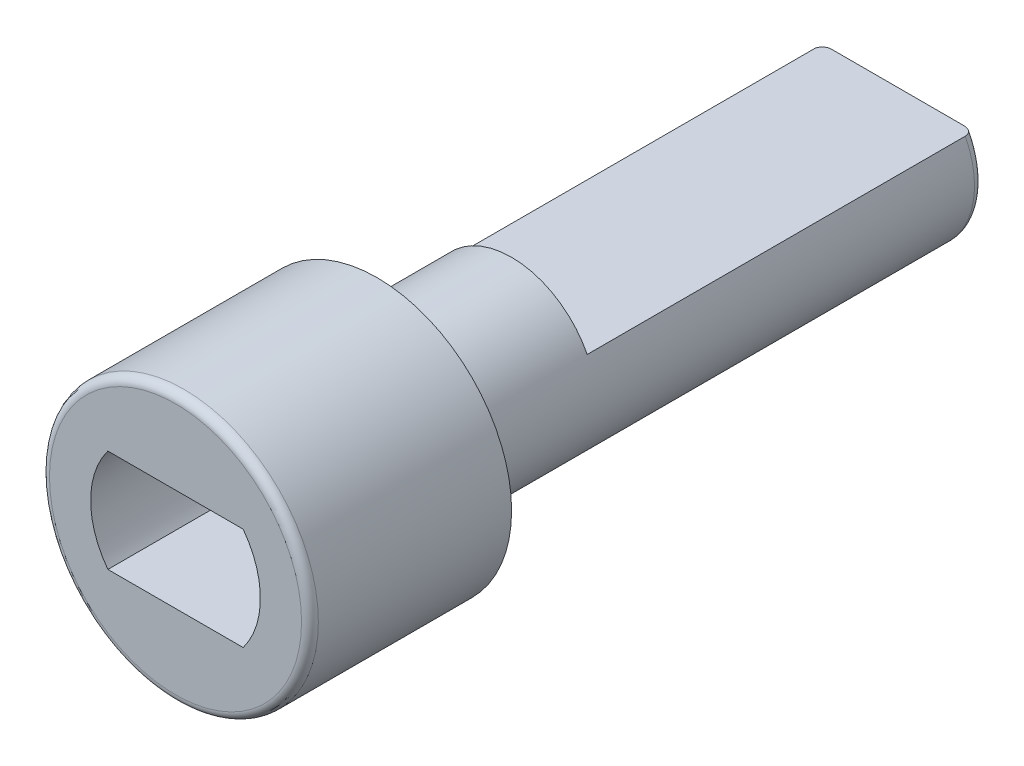
ISO-10303-21;
HEADER;
FILE_DESCRIPTION(('STEP AP214'),'2;1');
FILE_NAME('part.step','',(''),(''),'','','');
FILE_SCHEMA(('AUTOMOTIVE_DESIGN { 1 0 10303 214 1 1 1 1 }'));
ENDSEC;
DATA;
#1=APPLICATION_CONTEXT('core data for automotive mechanical design processes');
#2=APPLICATION_PROTOCOL_DEFINITION('international standard','automotive_design',2000,#1);
#3=PRODUCT_CONTEXT('',#1,'mechanical');
#4=PRODUCT('Part','Part','',(#3));
#5=PRODUCT_RELATED_PRODUCT_CATEGORY('part','',(#4));
#6=PRODUCT_DEFINITION_FORMATION('','',#4);
#7=PRODUCT_DEFINITION_CONTEXT('part definition',#1,'design');
#8=PRODUCT_DEFINITION('design','',#6,#7);
#9=PRODUCT_DEFINITION_SHAPE('','',#8);
#10=(LENGTH_UNIT() NAMED_UNIT(*) SI_UNIT(.MILLI.,.METRE.));
#11=(NAMED_UNIT(*) PLANE_ANGLE_UNIT() SI_UNIT($,.RADIAN.));
#12=(NAMED_UNIT(*) SI_UNIT($,.STERADIAN.) SOLID_ANGLE_UNIT());
#13=UNCERTAINTY_MEASURE_WITH_UNIT(LENGTH_MEASURE(1.E-05),#10,'distance_accuracy_value','');
#14=(GEOMETRIC_REPRESENTATION_CONTEXT(3) GLOBAL_UNCERTAINTY_ASSIGNED_CONTEXT((#13)) GLOBAL_UNIT_ASSIGNED_CONTEXT((#10,
#11,#12)) REPRESENTATION_CONTEXT('',''));
#15=CARTESIAN_POINT('',(0.,0.,0.));
#16=DIRECTION('',(0.,0.,1.));
#17=DIRECTION('',(1.,0.,0.));
#18=AXIS2_PLACEMENT_3D('',#15,#16,#17);
#19=CARTESIAN_POINT('',(0.,0.,15.5));
#20=DIRECTION('',(0.,0.,-1.));
#21=DIRECTION('',(-1.,0.,0.));
#22=AXIS2_PLACEMENT_3D('',#19,#20,#21);
#23=CYLINDRICAL_SURFACE('',#22,2.525);
#24=CARTESIAN_POINT('',(0.,0.,11.5));
#25=DIRECTION('',(0.,0.,1.));
#26=DIRECTION('',(1.,0.,0.));
#27=AXIS2_PLACEMENT_3D('',#24,#25,#26);
#28=CIRCLE('',#27,2.525);
#29=CARTESIAN_POINT('',(2.25,1.14591666363658,11.5));
#30=VERTEX_POINT('',#29);
#31=CARTESIAN_POINT('',(-2.25,1.14591666363658,11.5));
#32=VERTEX_POINT('',#31);
#33=EDGE_CURVE('E111',#30,#32,#28,.T.);
#34=ORIENTED_EDGE('',*,*,#33,.T.);
#35=DIRECTION('',(0.,0.,-1.));
#36=VECTOR('',#35,1.);
#37=CARTESIAN_POINT('',(-2.25,1.14591666363658,11.5));
#38=LINE('',#37,#36);
#39=CARTESIAN_POINT('',(-2.25,1.14591666363658,0.25));
#40=VERTEX_POINT('',#39);
#41=EDGE_CURVE('E101',#32,#40,#38,.T.);
#42=ORIENTED_EDGE('',*,*,#41,.T.);
#43=CARTESIAN_POINT('',(0.,0.,0.25));
#44=DIRECTION('',(0.,0.,1.));
#45=DIRECTION('',(1.,0.,0.));
#46=AXIS2_PLACEMENT_3D('',#43,#44,#45);
#47=CIRCLE('',#46,2.525);
#48=CARTESIAN_POINT('',(2.25,1.14591666363658,0.25));
#49=VERTEX_POINT('',#48);
#50=EDGE_CURVE('E183',#40,#49,#47,.T.);
#51=ORIENTED_EDGE('',*,*,#50,.T.);
#52=DIRECTION('',(0.,0.,-1.));
#53=VECTOR('',#52,1.);
#54=CARTESIAN_POINT('',(2.25,1.14591666363658,11.5));
#55=LINE('',#54,#53);
#56=EDGE_CURVE('E59',#30,#49,#55,.T.);
#57=ORIENTED_EDGE('',*,*,#56,.F.);
#58=EDGE_LOOP('',(#34,#42,#51,#57));
#59=FACE_BOUND('',#58,.T.);
#60=CARTESIAN_POINT('',(0.,0.,15.5));
#61=DIRECTION('',(0.,0.,1.));
#62=DIRECTION('',(1.,0.,0.));
#63=AXIS2_PLACEMENT_3D('',#60,#61,#62);
#64=CIRCLE('',#63,2.525);
#65=CARTESIAN_POINT('',(2.525,0.,15.5));
#66=VERTEX_POINT('',#65);
#67=EDGE_CURVE('E171',#66,#66,#64,.T.);
#68=ORIENTED_EDGE('',*,*,#67,.F.);
#69=EDGE_LOOP('',(#68));
#70=FACE_BOUND('',#69,.T.);
#71=ADVANCED_FACE('F38',(#59,#70),#23,.T.);
#72=CARTESIAN_POINT('',(0.,0.,0.));
#73=DIRECTION('',(0.,0.,1.));
#74=DIRECTION('',(1.,0.,0.));
#75=AXIS2_PLACEMENT_3D('',#72,#73,#74);
#76=PLANE('',#75);
#77=CARTESIAN_POINT('',(0.,0.,0.));
#78=DIRECTION('',(0.,0.,1.));
#79=DIRECTION('',(1.,0.,0.));
#80=AXIS2_PLACEMENT_3D('',#77,#78,#79);
#81=CIRCLE('',#80,2.275);
#82=CARTESIAN_POINT('',(1.96532440070335,1.14591666363658,0.));
#83=VERTEX_POINT('',#82);
#84=CARTESIAN_POINT('',(-1.96532440070335,1.14591666363658,0.));
#85=VERTEX_POINT('',#84);
#86=EDGE_CURVE('E186',#83,#85,#81,.F.);
#87=ORIENTED_EDGE('',*,*,#86,.T.);
#88=DIRECTION('',(-1.,0.,0.));
#89=VECTOR('',#88,1.);
#90=CARTESIAN_POINT('',(2.25,1.14591666363658,0.));
#91=LINE('',#90,#89);
#92=EDGE_CURVE('E116',#83,#85,#91,.T.);
#93=ORIENTED_EDGE('',*,*,#92,.F.);
#94=EDGE_LOOP('',(#87,#93));
#95=FACE_BOUND('',#94,.T.);
#96=ADVANCED_FACE('F229',(#95),#76,.F.);
#97=CARTESIAN_POINT('',(0.,0.,21.5));
#98=DIRECTION('',(0.,0.,-1.));
#99=DIRECTION('',(-1.,0.,0.));
#100=AXIS2_PLACEMENT_3D('',#97,#98,#99);
#101=CYLINDRICAL_SURFACE('',#100,4.);
#102=CARTESIAN_POINT('',(0.,0.,21.25));
#103=DIRECTION('',(0.,0.,1.));
#104=DIRECTION('',(1.,0.,0.));
#105=AXIS2_PLACEMENT_3D('',#102,#103,#104);
#106=CIRCLE('',#105,4.);
#107=CARTESIAN_POINT('',(4.,0.,21.25));
#108=VERTEX_POINT('',#107);
#109=EDGE_CURVE('E179',#108,#108,#106,.F.);
#110=ORIENTED_EDGE('',*,*,#109,.T.);
#111=EDGE_LOOP('',(#110));
#112=FACE_BOUND('',#111,.T.);
#113=CARTESIAN_POINT('',(0.,0.,15.5));
#114=DIRECTION('',(0.,0.,1.));
#115=DIRECTION('',(1.,0.,0.));
#116=AXIS2_PLACEMENT_3D('',#113,#114,#115);
#117=CIRCLE('',#116,4.);
#118=CARTESIAN_POINT('',(4.,0.,15.5));
#119=VERTEX_POINT('',#118);
#120=EDGE_CURVE('E159',#119,#119,#117,.T.);
#121=ORIENTED_EDGE('',*,*,#120,.T.);
#122=EDGE_LOOP('',(#121));
#123=FACE_BOUND('',#122,.T.);
#124=ADVANCED_FACE('F222',(#112,#123),#101,.T.);
#125=CARTESIAN_POINT('',(0.,0.,21.5));
#126=DIRECTION('',(0.,0.,1.));
#127=DIRECTION('',(1.,0.,0.));
#128=AXIS2_PLACEMENT_3D('',#125,#126,#127);
#129=PLANE('',#128);
#130=CARTESIAN_POINT('',(0.,0.,21.5));
#131=DIRECTION('',(0.,0.,1.));
#132=DIRECTION('',(1.,0.,0.));
#133=AXIS2_PLACEMENT_3D('',#130,#131,#132);
#134=CIRCLE('',#133,3.75);
#135=CARTESIAN_POINT('',(3.75,0.,21.5));
#136=VERTEX_POINT('',#135);
#137=EDGE_CURVE('E175',#136,#136,#134,.T.);
#138=ORIENTED_EDGE('',*,*,#137,.T.);
#139=EDGE_LOOP('',(#138));
#140=FACE_BOUND('',#139,.T.);
#141=CARTESIAN_POINT('',(0.,0.,21.5));
#142=DIRECTION('',(0.,0.,1.));
#143=DIRECTION('',(1.,0.,0.));
#144=AXIS2_PLACEMENT_3D('',#141,#142,#143);
#145=CIRCLE('',#144,2.525);
#146=CARTESIAN_POINT('',(-2.01246117974981,1.525,21.5));
#147=VERTEX_POINT('',#146);
#148=CARTESIAN_POINT('',(-2.01246117974981,-1.525,21.5));
#149=VERTEX_POINT('',#148);
#150=EDGE_CURVE('E67',#147,#149,#145,.T.);
#151=ORIENTED_EDGE('',*,*,#150,.F.);
#152=DIRECTION('',(1.,0.,0.));
#153=VECTOR('',#152,1.);
#154=CARTESIAN_POINT('',(-2.01246117974981,1.525,21.5));
#155=LINE('',#154,#153);
#156=CARTESIAN_POINT('',(2.01246117974981,1.525,21.5));
#157=VERTEX_POINT('',#156);
#158=EDGE_CURVE('E131',#147,#157,#155,.T.);
#159=ORIENTED_EDGE('',*,*,#158,.T.);
#160=CARTESIAN_POINT('',(0.,0.,21.5));
#161=DIRECTION('',(0.,0.,1.));
#162=DIRECTION('',(1.,0.,0.));
#163=AXIS2_PLACEMENT_3D('',#160,#161,#162);
#164=CIRCLE('',#163,2.525);
#165=CARTESIAN_POINT('',(2.01246117974981,-1.525,21.5));
#166=VERTEX_POINT('',#165);
#167=EDGE_CURVE('E149',#166,#157,#164,.T.);
#168=ORIENTED_EDGE('',*,*,#167,.F.);
#169=DIRECTION('',(1.,0.,0.));
#170=VECTOR('',#169,1.);
#171=CARTESIAN_POINT('',(-2.01246117974981,-1.525,21.5));
#172=LINE('',#171,#170);
#173=EDGE_CURVE('E145',#149,#166,#172,.T.);
#174=ORIENTED_EDGE('',*,*,#173,.F.);
#175=EDGE_LOOP('',(#151,#159,#168,#174));
#176=FACE_BOUND('',#175,.T.);
#177=ADVANCED_FACE('F219',(#140,#176),#129,.T.);
#178=CARTESIAN_POINT('',(0.,0.,15.5));
#179=DIRECTION('',(0.,0.,1.));
#180=DIRECTION('',(1.,0.,0.));
#181=AXIS2_PLACEMENT_3D('',#178,#179,#180);
#182=PLANE('',#181);
#183=ORIENTED_EDGE('',*,*,#67,.T.);
#184=EDGE_LOOP('',(#183));
#185=FACE_BOUND('',#184,.T.);
#186=ORIENTED_EDGE('',*,*,#120,.F.);
#187=EDGE_LOOP('',(#186));
#188=FACE_BOUND('',#187,.T.);
#189=ADVANCED_FACE('F218',(#185,#188),#182,.F.);
#190=CARTESIAN_POINT('',(0.,0.,16.5));
#191=DIRECTION('',(0.,0.,1.));
#192=DIRECTION('',(1.,0.,0.));
#193=AXIS2_PLACEMENT_3D('',#190,#191,#192);
#194=CYLINDRICAL_SURFACE('',#193,2.525);
#195=ORIENTED_EDGE('',*,*,#150,.T.);
#196=DIRECTION('',(0.,0.,1.));
#197=VECTOR('',#196,1.);
#198=CARTESIAN_POINT('',(-2.01246117974981,-1.525,16.5));
#199=LINE('',#198,#197);
#200=CARTESIAN_POINT('',(-2.01246117974981,-1.525,16.5));
#201=VERTEX_POINT('',#200);
#202=EDGE_CURVE('E142',#201,#149,#199,.T.);
#203=ORIENTED_EDGE('',*,*,#202,.F.);
#204=CARTESIAN_POINT('',(0.,0.,16.5));
#205=DIRECTION('',(0.,0.,1.));
#206=DIRECTION('',(1.,0.,0.));
#207=AXIS2_PLACEMENT_3D('',#204,#205,#206);
#208=CIRCLE('',#207,2.525);
#209=CARTESIAN_POINT('',(-2.01246117974981,1.525,16.5));
#210=VERTEX_POINT('',#209);
#211=EDGE_CURVE('E126',#210,#201,#208,.T.);
#212=ORIENTED_EDGE('',*,*,#211,.F.);
#213=DIRECTION('',(0.,0.,1.));
#214=VECTOR('',#213,1.);
#215=CARTESIAN_POINT('',(-2.01246117974981,1.525,16.5));
#216=LINE('',#215,#214);
#217=EDGE_CURVE('E156',#210,#147,#216,.T.);
#218=ORIENTED_EDGE('',*,*,#217,.T.);
#219=EDGE_LOOP('',(#195,#203,#212,#218));
#220=FACE_BOUND('',#219,.T.);
#221=ADVANCED_FACE('F208',(#220),#194,.F.);
#222=CARTESIAN_POINT('',(-2.01246117974981,1.525,16.5));
#223=DIRECTION('',(0.,-1.,0.));
#224=DIRECTION('',(0.,0.,-1.));
#225=AXIS2_PLACEMENT_3D('',#222,#223,#224);
#226=PLANE('',#225);
#227=ORIENTED_EDGE('',*,*,#158,.F.);
#228=ORIENTED_EDGE('',*,*,#217,.F.);
#229=DIRECTION('',(1.,0.,0.));
#230=VECTOR('',#229,1.);
#231=CARTESIAN_POINT('',(-2.01246117974981,1.525,16.5));
#232=LINE('',#231,#230);
#233=CARTESIAN_POINT('',(2.01246117974981,1.525,16.5));
#234=VERTEX_POINT('',#233);
#235=EDGE_CURVE('E139',#210,#234,#232,.T.);
#236=ORIENTED_EDGE('',*,*,#235,.T.);
#237=DIRECTION('',(0.,0.,1.));
#238=VECTOR('',#237,1.);
#239=CARTESIAN_POINT('',(2.01246117974981,1.525,16.5));
#240=LINE('',#239,#238);
#241=EDGE_CURVE('E160',#234,#157,#240,.T.);
#242=ORIENTED_EDGE('',*,*,#241,.T.);
#243=EDGE_LOOP('',(#227,#228,#236,#242));
#244=FACE_BOUND('',#243,.T.);
#245=ADVANCED_FACE('F204',(#244),#226,.T.);
#246=CARTESIAN_POINT('',(0.,0.,16.5));
#247=DIRECTION('',(0.,0.,1.));
#248=DIRECTION('',(1.,0.,0.));
#249=AXIS2_PLACEMENT_3D('',#246,#247,#248);
#250=CYLINDRICAL_SURFACE('',#249,2.525);
#251=ORIENTED_EDGE('',*,*,#167,.T.);
#252=ORIENTED_EDGE('',*,*,#241,.F.);
#253=CARTESIAN_POINT('',(0.,0.,16.5));
#254=DIRECTION('',(0.,0.,1.));
#255=DIRECTION('',(1.,0.,0.));
#256=AXIS2_PLACEMENT_3D('',#253,#254,#255);
#257=CIRCLE('',#256,2.525);
#258=CARTESIAN_POINT('',(2.01246117974981,-1.525,16.5));
#259=VERTEX_POINT('',#258);
#260=EDGE_CURVE('E135',#259,#234,#257,.T.);
#261=ORIENTED_EDGE('',*,*,#260,.F.);
#262=DIRECTION('',(0.,0.,1.));
#263=VECTOR('',#262,1.);
#264=CARTESIAN_POINT('',(2.01246117974981,-1.525,16.5));
#265=LINE('',#264,#263);
#266=EDGE_CURVE('E163',#259,#166,#265,.T.);
#267=ORIENTED_EDGE('',*,*,#266,.T.);
#268=EDGE_LOOP('',(#251,#252,#261,#267));
#269=FACE_BOUND('',#268,.T.);
#270=ADVANCED_FACE('F207',(#269),#250,.F.);
#271=CARTESIAN_POINT('',(-2.01246117974981,-1.525,16.5));
#272=DIRECTION('',(0.,-1.,0.));
#273=DIRECTION('',(0.,0.,-1.));
#274=AXIS2_PLACEMENT_3D('',#271,#272,#273);
#275=PLANE('',#274);
#276=ORIENTED_EDGE('',*,*,#173,.T.);
#277=ORIENTED_EDGE('',*,*,#266,.F.);
#278=DIRECTION('',(1.,0.,0.));
#279=VECTOR('',#278,1.);
#280=CARTESIAN_POINT('',(-2.01246117974981,-1.525,16.5));
#281=LINE('',#280,#279);
#282=EDGE_CURVE('E130',#201,#259,#281,.T.);
#283=ORIENTED_EDGE('',*,*,#282,.F.);
#284=ORIENTED_EDGE('',*,*,#202,.T.);
#285=EDGE_LOOP('',(#276,#277,#283,#284));
#286=FACE_BOUND('',#285,.T.);
#287=ADVANCED_FACE('F202',(#286),#275,.F.);
#288=CARTESIAN_POINT('',(0.,0.,16.5));
#289=DIRECTION('',(0.,0.,1.));
#290=DIRECTION('',(1.,0.,0.));
#291=AXIS2_PLACEMENT_3D('',#288,#289,#290);
#292=PLANE('',#291);
#293=ORIENTED_EDGE('',*,*,#211,.T.);
#294=ORIENTED_EDGE('',*,*,#282,.T.);
#295=ORIENTED_EDGE('',*,*,#260,.T.);
#296=ORIENTED_EDGE('',*,*,#235,.F.);
#297=EDGE_LOOP('',(#293,#294,#295,#296));
#298=FACE_BOUND('',#297,.T.);
#299=ADVANCED_FACE('F197',(#298),#292,.T.);
#300=CARTESIAN_POINT('',(0.,0.,21.25));
#301=DIRECTION('',(0.,0.,1.));
#302=DIRECTION('',(1.,0.,0.));
#303=AXIS2_PLACEMENT_3D('',#300,#301,#302);
#304=TOROIDAL_SURFACE('',#303,3.75,0.25);
#305=ORIENTED_EDGE('',*,*,#109,.F.);
#306=EDGE_LOOP('',(#305));
#307=FACE_BOUND('',#306,.T.);
#308=ORIENTED_EDGE('',*,*,#137,.F.);
#309=EDGE_LOOP('',(#308));
#310=FACE_BOUND('',#309,.T.);
#311=ADVANCED_FACE('F201',(#307,#310),#304,.T.);
#312=CARTESIAN_POINT('',(0.,0.,0.25));
#313=DIRECTION('',(0.,0.,1.));
#314=DIRECTION('',(1.,0.,0.));
#315=AXIS2_PLACEMENT_3D('',#312,#313,#314);
#316=TOROIDAL_SURFACE('',#315,2.275,0.25);
#317=CARTESIAN_POINT('',(-2.16900695528066,1.14591666363658,0.0745600172399887));
#318=CARTESIAN_POINT('',(-2.17923527849151,1.14591666363658,0.0837403206430242));
#319=CARTESIAN_POINT('',(-2.18874730279702,1.14591666363658,0.0937153460968964));
#320=CARTESIAN_POINT('',(-2.2060151504754,1.14591666363658,0.115088700523563));
#321=CARTESIAN_POINT('',(-2.21377174352699,1.14591666363658,0.126486402301537));
#322=CARTESIAN_POINT('',(-2.227240008607,1.14591666363658,0.150496408710378));
#323=CARTESIAN_POINT('',(-2.23294363721828,1.14591666363658,0.163113250323538));
#324=CARTESIAN_POINT('',(-2.24199518025735,1.14591666363658,0.18916826732096));
#325=CARTESIAN_POINT('',(-2.24534366625801,1.14591666363658,0.202606242562099));
#326=CARTESIAN_POINT('',(-2.24939097766036,1.14591666363658,0.229056482598229));
#327=CARTESIAN_POINT('',(-2.25023550269271,1.14591666363658,0.24204655582997));
#328=CARTESIAN_POINT('',(-2.24965180916554,1.14591666363658,0.267973668227039));
#329=CARTESIAN_POINT('',(-2.24822408637882,1.14591666363658,0.28091071834385));
#330=CARTESIAN_POINT('',(-2.24324550924022,1.14591666363658,0.305935527008762));
#331=CARTESIAN_POINT('',(-2.23976398058059,1.14591666363658,0.318037214595716));
#332=CARTESIAN_POINT('',(-2.23088223801558,1.14591666363658,0.34151188878085));
#333=CARTESIAN_POINT('',(-2.2254818848191,1.14591666363658,0.35288482240664));
#334=CARTESIAN_POINT('',(-2.21276035951773,1.14591666363658,0.375004103867307));
#335=CARTESIAN_POINT('',(-2.20538126379806,1.14591666363658,0.385717020487018));
#336=CARTESIAN_POINT('',(-2.18906105764171,1.14591666363658,0.405874726649951));
#337=CARTESIAN_POINT('',(-2.18011948159739,1.14591666363658,0.415319136699619));
#338=CARTESIAN_POINT('',(-2.16013433959433,1.14591666363658,0.433540275250816));
#339=CARTESIAN_POINT('',(-2.14897658419499,1.14591666363658,0.442191531745156));
#340=CARTESIAN_POINT('',(-2.12549335793827,1.14591666363658,0.457723912200645));
#341=CARTESIAN_POINT('',(-2.11316739471442,1.14591666363658,0.464604285204367));
#342=CARTESIAN_POINT('',(-2.08619976833496,1.14591666363658,0.477233098483796));
#343=CARTESIAN_POINT('',(-2.07145474340858,1.14591666363658,0.482760725507477));
#344=CARTESIAN_POINT('',(-2.04130503325845,1.14591666363658,0.491547046903452));
#345=CARTESIAN_POINT('',(-2.02590003566998,1.14591666363658,0.494804653997103));
#346=CARTESIAN_POINT('',(-1.99299355628005,1.14591666363658,0.499319237453634));
#347=CARTESIAN_POINT('',(-1.97545443588414,1.14591666363658,0.500303581202269));
#348=CARTESIAN_POINT('',(-1.94043433714648,1.14591666363658,0.499533963035862));
#349=CARTESIAN_POINT('',(-1.92295338798909,1.14591666363658,0.497778788401189));
#350=CARTESIAN_POINT('',(-1.88719931215402,1.14591666363658,0.491354858928986));
#351=CARTESIAN_POINT('',(-1.86896251216425,1.14591666363658,0.486481265733475));
#352=CARTESIAN_POINT('',(-1.83356731540892,1.14591666363658,0.473692454434547));
#353=CARTESIAN_POINT('',(-1.81640960345884,1.14591666363658,0.465775327048972));
#354=CARTESIAN_POINT('',(-1.78407215333158,1.14591666363658,0.447123745977301));
#355=CARTESIAN_POINT('',(-1.76886394063394,1.14591666363658,0.436439049824155));
#356=CARTESIAN_POINT('',(-1.74082634881597,1.14591666363658,0.412312581634786));
#357=CARTESIAN_POINT('',(-1.72799162712389,1.14591666363658,0.398877148710957));
#358=CARTESIAN_POINT('',(-1.70892683708783,1.14591666363658,0.373960065768304));
#359=CARTESIAN_POINT('',(-1.70187136838885,1.14591666363658,0.363106285045098));
#360=CARTESIAN_POINT('',(-1.68965249683912,1.14591666363658,0.34037850018025));
#361=CARTESIAN_POINT('',(-1.68448759316578,1.14591666363658,0.328505314577046));
#362=CARTESIAN_POINT('',(-1.67632062984279,1.14591666363658,0.303958215223189));
#363=CARTESIAN_POINT('',(-1.67333039392448,1.14591666363658,0.291280325652653));
#364=CARTESIAN_POINT('',(-1.66976570347284,1.14591666363658,0.265588288933217));
#365=CARTESIAN_POINT('',(-1.66919034926799,1.14591666363658,0.252574268829174));
#366=CARTESIAN_POINT('',(-1.67043402203394,1.14591666363658,0.227860711264956));
#367=CARTESIAN_POINT('',(-1.67203899124443,1.14591666363658,0.216149756975506));
#368=CARTESIAN_POINT('',(-1.67717638077969,1.14591666363658,0.193161698883742));
#369=CARTESIAN_POINT('',(-1.68070884246461,1.14591666363658,0.181884604396757));
#370=CARTESIAN_POINT('',(-1.68955668141995,1.14591666363658,0.159928350865387));
#371=CARTESIAN_POINT('',(-1.69488952089875,1.14591666363658,0.149256292296353));
#372=CARTESIAN_POINT('',(-1.70708645950403,1.14591666363658,0.128830699568216));
#373=CARTESIAN_POINT('',(-1.71395107998455,1.14591666363658,0.119077479754526));
#374=CARTESIAN_POINT('',(-1.72986037963059,1.14591666363658,0.0995155204509449));
#375=CARTESIAN_POINT('',(-1.73906751283677,1.14591666363658,0.0898392795008385));
#376=CARTESIAN_POINT('',(-1.75876660698449,1.14591666363658,0.0719015353216568));
#377=CARTESIAN_POINT('',(-1.76925929055784,1.14591666363658,0.063640834109247));
#378=CARTESIAN_POINT('',(-1.79307603193074,1.14591666363658,0.0473393444209031));
#379=CARTESIAN_POINT('',(-1.80658096595654,1.14591666363658,0.0395626729303328));
#380=CARTESIAN_POINT('',(-1.83457709696002,1.14591666363658,0.0260553574753484));
#381=CARTESIAN_POINT('',(-1.84906886896315,1.14591666363658,0.0203259187811357));
#382=CARTESIAN_POINT('',(-1.88085554259765,1.14591666363658,0.0102710682532301));
#383=CARTESIAN_POINT('',(-1.898253028743,1.14591666363658,0.00626789601899665));
#384=CARTESIAN_POINT('',(-1.93346568317709,1.14591666363658,0.00104211391403849));
#385=CARTESIAN_POINT('',(-1.95128105914384,1.14591666363658,-0.00017908250124572));
#386=CARTESIAN_POINT('',(-1.98801220297235,1.14591666363658,0.000233951888678658));
#387=CARTESIAN_POINT('',(-2.0069264067048,1.14591666363658,0.00205339269273313));
#388=CARTESIAN_POINT('',(-2.0441534739392,1.14591666363658,0.00897451036961207));
#389=CARTESIAN_POINT('',(-2.06246640204242,1.14591666363658,0.0140758334150535));
#390=CARTESIAN_POINT('',(-2.09641971212324,1.14591666363658,0.0270393529754741));
#391=CARTESIAN_POINT('',(-2.11215666740206,1.14591666363658,0.0346476499209941));
#392=CARTESIAN_POINT('',(-2.14197877481453,1.14591666363658,0.0526024389262235));
#393=CARTESIAN_POINT('',(-2.15606615905571,1.14591666363658,0.0629451676529317));
#394=CARTESIAN_POINT('',(-2.16900695528066,1.14591666363658,0.0745600172399887));
#395=B_SPLINE_CURVE_WITH_KNOTS('',3,(#317,#318,#319,#320,#321,#322,#323,#324,#325,#326,#327,
#328,#329,#330,#331,#332,#333,#334,#335,#336,#337,#338,#339,#340,#341,#342,#343,#344,#345,#346,
#347,#348,#349,#350,#351,#352,#353,#354,#355,#356,#357,#358,#359,#360,#361,#362,#363,#364,#365,
#366,#367,#368,#369,#370,#371,#372,#373,#374,#375,#376,#377,#378,#379,#380,#381,#382,#383,#384,
#385,#386,#387,#388,#389,#390,#391,#392,#393,#394),.UNSPECIFIED.,.T.,.F.,(4,2,2,2,2,2,2,2,2,2,2,
2,2,2,2,2,2,2,2,2,2,2,2,2,2,2,2,2,2,2,2,2,2,2,2,2,2,2,4),(0.,0.0411812140181934,
0.0823443367679058,0.123667022897885,0.164979676903545,0.203836075818181,0.242683997970129,
0.280290128747462,0.317898989982826,0.35675899163058,0.39563059308262,0.437814536177074,
0.480016338349271,0.527065874192375,0.574137930039651,0.626614338655403,0.679113983918375,
0.735475755712047,0.791872942450238,0.847319146597388,0.902638984066066,0.941319330890322,
0.979968904433439,1.01882707705635,1.05767077166336,1.09296385043258,1.12825768655092,
1.16390417861856,1.19956282181347,1.23948039566988,1.2794205117826,1.32599041197581,
1.37258768433193,1.42591408317778,1.47926756985574,1.53599067903475,1.5927076737876,
1.64488126531955,1.69698342203863),.UNSPECIFIED.);
#396=EDGE_CURVE('E11',#85,#40,#395,.T.);
#397=ORIENTED_EDGE('',*,*,#396,.F.);
#398=ORIENTED_EDGE('',*,*,#86,.F.);
#399=CARTESIAN_POINT('',(1.67509249101219,1.14591666363658,0.202537561397909));
#400=CARTESIAN_POINT('',(1.67239202089577,1.14591666363658,0.214064504984725));
#401=CARTESIAN_POINT('',(1.67066112820519,1.14591666363658,0.22582044206193));
#402=CARTESIAN_POINT('',(1.66924227121717,1.14591666363658,0.249455619216457));
#403=CARTESIAN_POINT('',(1.66955414473728,1.14591666363658,0.261334849430337));
#404=CARTESIAN_POINT('',(1.67219998935459,1.14591666363658,0.28485197521267));
#405=CARTESIAN_POINT('',(1.674532041798,1.14591666363658,0.296490089044604));
#406=CARTESIAN_POINT('',(1.68107950663986,1.14591666363658,0.319221506119961));
#407=CARTESIAN_POINT('',(1.68529544231545,1.14591666363658,0.330314657040783));
#408=CARTESIAN_POINT('',(1.69550049423728,1.14591666363658,0.351926634550136));
#409=CARTESIAN_POINT('',(1.7015243066217,1.14591666363658,0.362428949838255));
#410=CARTESIAN_POINT('',(1.71505009451758,1.14591666363658,0.382428882492165));
#411=CARTESIAN_POINT('',(1.72255255028531,1.14591666363658,0.391926171885956));
#412=CARTESIAN_POINT('',(1.73986829312822,1.14591666363658,0.411003369516309));
#413=CARTESIAN_POINT('',(1.74985647201955,1.14591666363658,0.420424186880502));
#414=CARTESIAN_POINT('',(1.7710718509739,1.14591666363658,0.437744751109559));
#415=CARTESIAN_POINT('',(1.7822997809675,1.14591666363658,0.445643594285755));
#416=CARTESIAN_POINT('',(1.80766610343088,1.14591666363658,0.46106276045772));
#417=CARTESIAN_POINT('',(1.82197729384993,1.14591666363658,0.468299172396347));
#418=CARTESIAN_POINT('',(1.8515073212474,1.14591666363658,0.480591533054059));
#419=CARTESIAN_POINT('',(1.86672668700903,1.14591666363658,0.485646197072698));
#420=CARTESIAN_POINT('',(1.89979762321981,1.14591666363658,0.494061934312583));
#421=CARTESIAN_POINT('',(1.91773000466171,1.14591666363658,0.497108226044888));
#422=CARTESIAN_POINT('',(1.95385670814053,1.14591666363658,0.500291746797074));
#423=CARTESIAN_POINT('',(1.9720511379664,1.14591666363658,0.500427742417435));
#424=CARTESIAN_POINT('',(2.00901978726345,1.14591666363658,0.497665616096406));
#425=CARTESIAN_POINT('',(2.02778444503381,1.14591666363658,0.494634184152613));
#426=CARTESIAN_POINT('',(2.06448143519293,1.14591666363658,0.485271172012982));
#427=CARTESIAN_POINT('',(2.08241389848253,1.14591666363658,0.478940112764506));
#428=CARTESIAN_POINT('',(2.11576326983908,1.14591666363658,0.463447713827499));
#429=CARTESIAN_POINT('',(2.13126574727001,1.14591666363658,0.454471762375604));
#430=CARTESIAN_POINT('',(2.16025977815496,1.14591666363658,0.433703504021072));
#431=CARTESIAN_POINT('',(2.17375320000556,1.14591666363658,0.421913840738412));
#432=CARTESIAN_POINT('',(2.19653208663637,1.14591666363658,0.397399634550405));
#433=CARTESIAN_POINT('',(2.20613045154332,1.14591666363658,0.384966156683157));
#434=CARTESIAN_POINT('',(2.22274975256713,1.14591666363658,0.358481123661624));
#435=CARTESIAN_POINT('',(2.22977328170919,1.14591666363658,0.344431215200461));
#436=CARTESIAN_POINT('',(2.24015465686554,1.14591666363658,0.317014848055439));
#437=CARTESIAN_POINT('',(2.24385846963212,1.14591666363658,0.30377882473055));
#438=CARTESIAN_POINT('',(2.24879575887465,1.14591666363658,0.276854935511038));
#439=CARTESIAN_POINT('',(2.25003055069027,1.14591666363658,0.263167314152536));
#440=CARTESIAN_POINT('',(2.24997053057501,1.14591666363658,0.236800685736387));
#441=CARTESIAN_POINT('',(2.2488535731629,1.14591666363658,0.224120895939196));
#442=CARTESIAN_POINT('',(2.2444962990402,1.14591666363658,0.199133755547628));
#443=CARTESIAN_POINT('',(2.24125619703226,1.14591666363658,0.186826367425836));
#444=CARTESIAN_POINT('',(2.23280767400101,1.14591666363658,0.162960041563747));
#445=CARTESIAN_POINT('',(2.22760625336457,1.14591666363658,0.151398611219412));
#446=CARTESIAN_POINT('',(2.21543901072648,1.14591666363658,0.129247876267102));
#447=CARTESIAN_POINT('',(2.20847285689435,1.14591666363658,0.118658754997417));
#448=CARTESIAN_POINT('',(2.19256873511035,1.14591666363658,0.098078159903885));
#449=CARTESIAN_POINT('',(2.18353962545376,1.14591666363658,0.088157302630448));
#450=CARTESIAN_POINT('',(2.16408202535539,1.14591666363658,0.0698030862301378));
#451=CARTESIAN_POINT('',(2.15365303166618,1.14591666363658,0.061370264575673));
#452=CARTESIAN_POINT('',(2.13058101000234,1.14591666363658,0.0453188622098782));
#453=CARTESIAN_POINT('',(2.11782073017038,1.14591666363658,0.0378690347306498));
#454=CARTESIAN_POINT('',(2.09133390803994,1.14591666363658,0.0249564606434154));
#455=CARTESIAN_POINT('',(2.07760692315744,1.14591666363658,0.0194946313471584));
#456=CARTESIAN_POINT('',(2.04784454658289,1.14591666363658,0.0100397725903756));
#457=CARTESIAN_POINT('',(2.03172892158225,1.14591666363658,0.00629910398947454));
#458=CARTESIAN_POINT('',(1.99911832458776,1.14591666363658,0.00129876660157942));
#459=CARTESIAN_POINT('',(1.98262318969669,1.14591666363658,4.01840872017672E-05));
#460=CARTESIAN_POINT('',(1.94793033233981,1.14591666363658,-4.23042324462155E-05));
#461=CARTESIAN_POINT('',(1.92973161923979,1.14591666363658,0.001396923847206));
#462=CARTESIAN_POINT('',(1.89379011819986,1.14591666363658,0.00718085262750751));
#463=CARTESIAN_POINT('',(1.87604766387837,1.14591666363658,0.0115276199331083));
#464=CARTESIAN_POINT('',(1.84080640098725,1.14591666363658,0.0233080951442212));
#465=CARTESIAN_POINT('',(1.82334678047297,1.14591666363658,0.0308600490699668));
#466=CARTESIAN_POINT('',(1.79007410571473,1.14591666363658,0.0489906926991371));
#467=CARTESIAN_POINT('',(1.77425930518064,1.14591666363658,0.0595661267270027));
#468=CARTESIAN_POINT('',(1.7484880684723,1.14591666363658,0.0807636526515568));
#469=CARTESIAN_POINT('',(1.73803172623176,1.14591666363658,0.090779981515133));
#470=CARTESIAN_POINT('',(1.7189062211354,1.14591666363658,0.112392349761753));
#471=CARTESIAN_POINT('',(1.71023462126087,1.14591666363658,0.123986198639426));
#472=CARTESIAN_POINT('',(1.69637124636247,1.14591666363658,0.146498097534405));
#473=CARTESIAN_POINT('',(1.69084050066405,1.14591666363658,0.157207388950911));
#474=CARTESIAN_POINT('',(1.68157175240933,1.14591666363658,0.179378611371341));
#475=CARTESIAN_POINT('',(1.67783289068943,1.14591666363658,0.190840178674486));
#476=CARTESIAN_POINT('',(1.67509249101219,1.14591666363658,0.202537561397909));
#477=B_SPLINE_CURVE_WITH_KNOTS('',3,(#399,#400,#401,#402,#403,#404,#405,#406,#407,#408,#409,
#410,#411,#412,#413,#414,#415,#416,#417,#418,#419,#420,#421,#422,#423,#424,#425,#426,#427,#428,
#429,#430,#431,#432,#433,#434,#435,#436,#437,#438,#439,#440,#441,#442,#443,#444,#445,#446,#447,
#448,#449,#450,#451,#452,#453,#454,#455,#456,#457,#458,#459,#460,#461,#462,#463,#464,#465,#466,
#467,#468,#469,#470,#471,#472,#473,#474,#475,#476),.UNSPECIFIED.,.T.,.F.,(4,2,2,2,2,2,2,2,2,2,2,
2,2,2,2,2,2,2,2,2,2,2,2,2,2,2,2,2,2,2,2,2,2,2,2,2,2,2,4),(0.,0.0354753985110433,
0.0709479805387278,0.106386909567786,0.141835688421673,0.17801377454823,0.214203630565345,
0.255237464286842,0.296295587715346,0.344215959877478,0.392164511103892,0.446492144334909,
0.500842801460312,0.557576778649671,0.614301801353027,0.667737818456036,0.721123826095895,
0.767975304435593,0.814779469862616,0.855794115021257,0.896786904318957,0.93479116930925,
0.972791591717463,1.01065764656216,1.04853082681846,1.08860751370174,1.12869864662209,
1.17284680836451,1.21701531541785,1.26644352283208,1.31589335745891,1.37041834740313,
1.42498213356343,1.4817628314587,1.53848261685227,1.58175203996325,1.62496198198579,
1.66097921180311,1.69697915493845),.UNSPECIFIED.);
#478=EDGE_CURVE('E52',#49,#83,#477,.T.);
#479=ORIENTED_EDGE('',*,*,#478,.F.);
#480=ORIENTED_EDGE('',*,*,#50,.F.);
#481=EDGE_LOOP('',(#397,#398,#479,#480));
#482=FACE_BOUND('',#481,.T.);
#483=ADVANCED_FACE('F40',(#482),#316,.T.);
#484=CARTESIAN_POINT('',(2.25,1.14591666363658,11.5));
#485=DIRECTION('',(0.,-1.,0.));
#486=DIRECTION('',(0.,0.,-1.));
#487=AXIS2_PLACEMENT_3D('',#484,#485,#486);
#488=PLANE('',#487);
#489=ORIENTED_EDGE('',*,*,#396,.T.);
#490=ORIENTED_EDGE('',*,*,#41,.F.);
#491=DIRECTION('',(-1.,0.,0.));
#492=VECTOR('',#491,1.);
#493=CARTESIAN_POINT('',(2.25,1.14591666363658,11.5));
#494=LINE('',#493,#492);
#495=EDGE_CURVE('E104',#30,#32,#494,.T.);
#496=ORIENTED_EDGE('',*,*,#495,.F.);
#497=ORIENTED_EDGE('',*,*,#56,.T.);
#498=ORIENTED_EDGE('',*,*,#478,.T.);
#499=ORIENTED_EDGE('',*,*,#92,.T.);
#500=EDGE_LOOP('',(#489,#490,#496,#497,#498,#499));
#501=FACE_BOUND('',#500,.T.);
#502=ADVANCED_FACE('F103',(#501),#488,.F.);
#503=CARTESIAN_POINT('',(0.,0.,11.5));
#504=DIRECTION('',(0.,0.,1.));
#505=DIRECTION('',(1.,0.,0.));
#506=AXIS2_PLACEMENT_3D('',#503,#504,#505);
#507=PLANE('',#506);
#508=ORIENTED_EDGE('',*,*,#495,.T.);
#509=ORIENTED_EDGE('',*,*,#33,.F.);
#510=EDGE_LOOP('',(#508,#509));
#511=FACE_BOUND('',#510,.T.);
#512=ADVANCED_FACE('F114',(#511),#507,.F.);
#513=CLOSED_SHELL('',(#71,#96,#124,#177,#189,#221,#245,#270,#287,#299,#311,#483,#502,#512));
#514=MANIFOLD_SOLID_BREP('B2',#513);
#515=ADVANCED_BREP_SHAPE_REPRESENTATION('',(#18,#514),#14);
#516=SHAPE_DEFINITION_REPRESENTATION(#9,#515);
ENDSEC;
END-ISO-10303-21;
